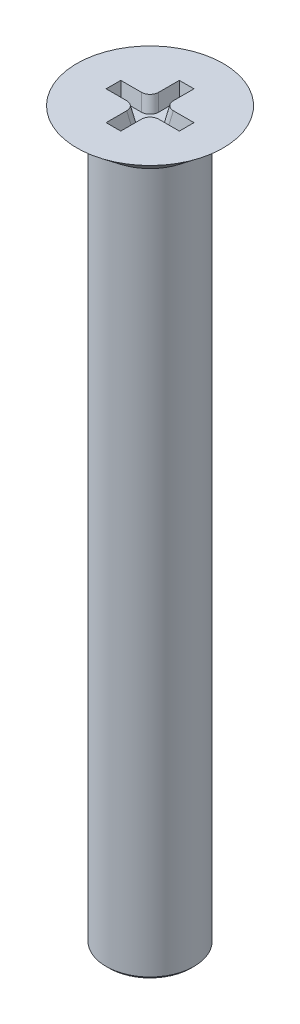
ISO-10303-21;
HEADER;
FILE_DESCRIPTION(('STEP AP214'),'2;1');
FILE_NAME('part.step','',(''),(''),'','','');
FILE_SCHEMA(('AUTOMOTIVE_DESIGN { 1 0 10303 214 1 1 1 1 }'));
ENDSEC;
DATA;
#1=APPLICATION_CONTEXT('core data for automotive mechanical design processes');
#2=APPLICATION_PROTOCOL_DEFINITION('international standard','automotive_design',2000,#1);
#3=PRODUCT_CONTEXT('',#1,'mechanical');
#4=PRODUCT('Part','Part','',(#3));
#5=PRODUCT_RELATED_PRODUCT_CATEGORY('part','',(#4));
#6=PRODUCT_DEFINITION_FORMATION('','',#4);
#7=PRODUCT_DEFINITION_CONTEXT('part definition',#1,'design');
#8=PRODUCT_DEFINITION('design','',#6,#7);
#9=PRODUCT_DEFINITION_SHAPE('','',#8);
#10=(LENGTH_UNIT() NAMED_UNIT(*) SI_UNIT(.MILLI.,.METRE.));
#11=(NAMED_UNIT(*) PLANE_ANGLE_UNIT() SI_UNIT($,.RADIAN.));
#12=(NAMED_UNIT(*) SI_UNIT($,.STERADIAN.) SOLID_ANGLE_UNIT());
#13=UNCERTAINTY_MEASURE_WITH_UNIT(LENGTH_MEASURE(1.E-05),#10,'distance_accuracy_value','');
#14=(GEOMETRIC_REPRESENTATION_CONTEXT(3) GLOBAL_UNCERTAINTY_ASSIGNED_CONTEXT((#13)) GLOBAL_UNIT_ASSIGNED_CONTEXT((#10,
#11,#12)) REPRESENTATION_CONTEXT('',''));
#15=CARTESIAN_POINT('',(0.,0.,0.));
#16=DIRECTION('',(0.,0.,1.));
#17=DIRECTION('',(1.,0.,0.));
#18=AXIS2_PLACEMENT_3D('',#15,#16,#17);
#19=CARTESIAN_POINT('',(0.,0.,0.));
#20=DIRECTION('',(0.,1.,0.));
#21=DIRECTION('',(0.,0.,1.));
#22=AXIS2_PLACEMENT_3D('',#19,#20,#21);
#23=PLANE('',#22);
#24=CARTESIAN_POINT('',(0.,0.,0.));
#25=DIRECTION('',(0.,-1.,0.));
#26=DIRECTION('',(0.,0.,-1.));
#27=AXIS2_PLACEMENT_3D('',#24,#25,#26);
#28=CIRCLE('',#27,2.5);
#29=CARTESIAN_POINT('',(0.,0.,-2.5));
#30=VERTEX_POINT('',#29);
#31=EDGE_CURVE('E256',#30,#30,#28,.T.);
#32=ORIENTED_EDGE('',*,*,#31,.F.);
#33=EDGE_LOOP('',(#32));
#34=FACE_BOUND('',#33,.T.);
#35=DIRECTION('',(1.,0.,0.));
#36=VECTOR('',#35,1.);
#37=CARTESIAN_POINT('',(0.,0.,-0.25));
#38=LINE('',#37,#36);
#39=CARTESIAN_POINT('',(-1.25,0.,-0.25));
#40=VERTEX_POINT('',#39);
#41=CARTESIAN_POINT('',(-0.545442325903662,0.,-0.25));
#42=VERTEX_POINT('',#41);
#43=EDGE_CURVE('E186',#40,#42,#38,.T.);
#44=ORIENTED_EDGE('',*,*,#43,.T.);
#45=CARTESIAN_POINT('',(-0.554627983565723,0.,-0.554627983565723));
#46=DIRECTION('',(0.,1.,0.));
#47=DIRECTION('',(-0.707106781186548,0.,-0.707106781186547));
#48=AXIS2_PLACEMENT_3D('',#45,#46,#47);
#49=ELLIPSE('',#48,0.309186702079241,0.3);
#50=CARTESIAN_POINT('',(-0.25,0.,-0.545442325903662));
#51=VERTEX_POINT('',#50);
#52=EDGE_CURVE('E274',#42,#51,#49,.T.);
#53=ORIENTED_EDGE('',*,*,#52,.T.);
#54=DIRECTION('',(0.,0.,1.));
#55=VECTOR('',#54,1.);
#56=CARTESIAN_POINT('',(-0.25,0.,0.));
#57=LINE('',#56,#55);
#58=CARTESIAN_POINT('',(-0.25,0.,-1.25));
#59=VERTEX_POINT('',#58);
#60=EDGE_CURVE('E184',#59,#51,#57,.T.);
#61=ORIENTED_EDGE('',*,*,#60,.F.);
#62=DIRECTION('',(1.,0.,0.));
#63=VECTOR('',#62,1.);
#64=CARTESIAN_POINT('',(0.,0.,-1.25));
#65=LINE('',#64,#63);
#66=CARTESIAN_POINT('',(0.25,0.,-1.25));
#67=VERTEX_POINT('',#66);
#68=EDGE_CURVE('E163',#59,#67,#65,.T.);
#69=ORIENTED_EDGE('',*,*,#68,.T.);
#70=DIRECTION('',(0.,0.,1.));
#71=VECTOR('',#70,1.);
#72=CARTESIAN_POINT('',(0.25,0.,0.));
#73=LINE('',#72,#71);
#74=CARTESIAN_POINT('',(0.25,0.,-0.545442325903662));
#75=VERTEX_POINT('',#74);
#76=EDGE_CURVE('E175',#67,#75,#73,.T.);
#77=ORIENTED_EDGE('',*,*,#76,.T.);
#78=CARTESIAN_POINT('',(0.554627983565724,0.,-0.554627983565723));
#79=DIRECTION('',(0.,1.,0.));
#80=DIRECTION('',(0.707106781186547,0.,-0.707106781186548));
#81=AXIS2_PLACEMENT_3D('',#78,#79,#80);
#82=ELLIPSE('',#81,0.309186702079241,0.3);
#83=CARTESIAN_POINT('',(0.545442325903663,0.,-0.25));
#84=VERTEX_POINT('',#83);
#85=EDGE_CURVE('E272',#75,#84,#82,.T.);
#86=ORIENTED_EDGE('',*,*,#85,.T.);
#87=DIRECTION('',(1.,0.,0.));
#88=VECTOR('',#87,1.);
#89=CARTESIAN_POINT('',(0.,0.,-0.25));
#90=LINE('',#89,#88);
#91=CARTESIAN_POINT('',(1.25,0.,-0.25));
#92=VERTEX_POINT('',#91);
#93=EDGE_CURVE('E180',#84,#92,#90,.T.);
#94=ORIENTED_EDGE('',*,*,#93,.T.);
#95=DIRECTION('',(0.,0.,-1.));
#96=VECTOR('',#95,1.);
#97=CARTESIAN_POINT('',(1.25,0.,0.));
#98=LINE('',#97,#96);
#99=CARTESIAN_POINT('',(1.25,0.,0.25));
#100=VERTEX_POINT('',#99);
#101=EDGE_CURVE('E206',#100,#92,#98,.T.);
#102=ORIENTED_EDGE('',*,*,#101,.F.);
#103=DIRECTION('',(1.,0.,0.));
#104=VECTOR('',#103,1.);
#105=CARTESIAN_POINT('',(0.,0.,0.25));
#106=LINE('',#105,#104);
#107=CARTESIAN_POINT('',(0.545442325903663,0.,0.25));
#108=VERTEX_POINT('',#107);
#109=EDGE_CURVE('E204',#108,#100,#106,.T.);
#110=ORIENTED_EDGE('',*,*,#109,.F.);
#111=CARTESIAN_POINT('',(0.554627983565724,0.,0.554627983565724));
#112=DIRECTION('',(0.,1.,0.));
#113=DIRECTION('',(0.707106781186548,0.,0.707106781186547));
#114=AXIS2_PLACEMENT_3D('',#111,#112,#113);
#115=ELLIPSE('',#114,0.309186702079241,0.3);
#116=CARTESIAN_POINT('',(0.25,0.,0.545442325903663));
#117=VERTEX_POINT('',#116);
#118=EDGE_CURVE('E268',#108,#117,#115,.T.);
#119=ORIENTED_EDGE('',*,*,#118,.T.);
#120=DIRECTION('',(0.,0.,1.));
#121=VECTOR('',#120,1.);
#122=CARTESIAN_POINT('',(0.25,0.,0.));
#123=LINE('',#122,#121);
#124=CARTESIAN_POINT('',(0.250000000000001,0.,1.25));
#125=VERTEX_POINT('',#124);
#126=EDGE_CURVE('E202',#117,#125,#123,.T.);
#127=ORIENTED_EDGE('',*,*,#126,.T.);
#128=DIRECTION('',(1.,0.,0.));
#129=VECTOR('',#128,1.);
#130=CARTESIAN_POINT('',(0.,0.,1.25));
#131=LINE('',#130,#129);
#132=CARTESIAN_POINT('',(-0.249999999999999,0.,1.25));
#133=VERTEX_POINT('',#132);
#134=EDGE_CURVE('E199',#133,#125,#131,.T.);
#135=ORIENTED_EDGE('',*,*,#134,.F.);
#136=DIRECTION('',(0.,0.,1.));
#137=VECTOR('',#136,1.);
#138=CARTESIAN_POINT('',(-0.25,0.,0.));
#139=LINE('',#138,#137);
#140=CARTESIAN_POINT('',(-0.25,0.,0.545442325903662));
#141=VERTEX_POINT('',#140);
#142=EDGE_CURVE('E197',#141,#133,#139,.T.);
#143=ORIENTED_EDGE('',*,*,#142,.F.);
#144=CARTESIAN_POINT('',(-0.554627983565723,0.,0.554627983565724));
#145=DIRECTION('',(0.,1.,0.));
#146=DIRECTION('',(-0.707106781186547,0.,0.707106781186548));
#147=AXIS2_PLACEMENT_3D('',#144,#145,#146);
#148=ELLIPSE('',#147,0.309186702079241,0.3);
#149=CARTESIAN_POINT('',(-0.545442325903662,0.,0.25));
#150=VERTEX_POINT('',#149);
#151=EDGE_CURVE('E270',#141,#150,#148,.T.);
#152=ORIENTED_EDGE('',*,*,#151,.T.);
#153=DIRECTION('',(1.,0.,0.));
#154=VECTOR('',#153,1.);
#155=CARTESIAN_POINT('',(0.,0.,0.25));
#156=LINE('',#155,#154);
#157=CARTESIAN_POINT('',(-1.25,0.,0.25));
#158=VERTEX_POINT('',#157);
#159=EDGE_CURVE('E194',#158,#150,#156,.T.);
#160=ORIENTED_EDGE('',*,*,#159,.F.);
#161=DIRECTION('',(0.,0.,-1.));
#162=VECTOR('',#161,1.);
#163=CARTESIAN_POINT('',(-1.25,0.,0.));
#164=LINE('',#163,#162);
#165=EDGE_CURVE('E191',#158,#40,#164,.T.);
#166=ORIENTED_EDGE('',*,*,#165,.T.);
#167=EDGE_LOOP('',(#44,#53,#61,#69,#77,#86,#94,#102,#110,#119,#127,#135,#143,#152,#160,#166));
#168=FACE_BOUND('',#167,.T.);
#169=ADVANCED_FACE('F47',(#34,#168),#23,.T.);
#170=CARTESIAN_POINT('',(0.,-0.8,0.));
#171=DIRECTION('',(0.,1.,0.));
#172=DIRECTION('',(0.,0.,1.));
#173=AXIS2_PLACEMENT_3D('',#170,#171,#172);
#174=CONICAL_SURFACE('',#173,1.5,0.896055384571344);
#175=ORIENTED_EDGE('',*,*,#31,.T.);
#176=EDGE_LOOP('',(#175));
#177=FACE_BOUND('',#176,.T.);
#178=CARTESIAN_POINT('',(0.,-0.8,0.));
#179=DIRECTION('',(0.,-1.,0.));
#180=DIRECTION('',(0.,0.,-1.));
#181=AXIS2_PLACEMENT_3D('',#178,#179,#180);
#182=CIRCLE('',#181,1.5);
#183=CARTESIAN_POINT('',(0.,-0.8,-1.5));
#184=VERTEX_POINT('',#183);
#185=EDGE_CURVE('E212',#184,#184,#182,.T.);
#186=ORIENTED_EDGE('',*,*,#185,.F.);
#187=EDGE_LOOP('',(#186));
#188=FACE_BOUND('',#187,.T.);
#189=ADVANCED_FACE('F351',(#177,#188),#174,.T.);
#190=CARTESIAN_POINT('',(0.,-24.8,0.));
#191=DIRECTION('',(0.,1.,0.));
#192=DIRECTION('',(0.,0.,1.));
#193=AXIS2_PLACEMENT_3D('',#190,#191,#192);
#194=CYLINDRICAL_SURFACE('',#193,1.5);
#195=CARTESIAN_POINT('',(0.,-24.7,0.));
#196=DIRECTION('',(0.,-1.,0.));
#197=DIRECTION('',(0.,0.,-1.));
#198=AXIS2_PLACEMENT_3D('',#195,#196,#197);
#199=CIRCLE('',#198,1.5);
#200=CARTESIAN_POINT('',(0.,-24.7,-1.5));
#201=VERTEX_POINT('',#200);
#202=EDGE_CURVE('E262',#201,#201,#199,.F.);
#203=ORIENTED_EDGE('',*,*,#202,.T.);
#204=EDGE_LOOP('',(#203));
#205=FACE_BOUND('',#204,.T.);
#206=ORIENTED_EDGE('',*,*,#185,.T.);
#207=EDGE_LOOP('',(#206));
#208=FACE_BOUND('',#207,.T.);
#209=ADVANCED_FACE('F359',(#205,#208),#194,.T.);
#210=CARTESIAN_POINT('',(0.,-24.8,0.));
#211=DIRECTION('',(0.,-1.,0.));
#212=DIRECTION('',(0.,0.,-1.));
#213=AXIS2_PLACEMENT_3D('',#210,#211,#212);
#214=PLANE('',#213);
#215=CARTESIAN_POINT('',(0.,-24.8,0.));
#216=DIRECTION('',(0.,-1.,0.));
#217=DIRECTION('',(0.,0.,-1.));
#218=AXIS2_PLACEMENT_3D('',#215,#216,#217);
#219=CIRCLE('',#218,1.4);
#220=CARTESIAN_POINT('',(0.,-24.8,-1.4));
#221=VERTEX_POINT('',#220);
#222=EDGE_CURVE('E259',#221,#221,#219,.T.);
#223=ORIENTED_EDGE('',*,*,#222,.T.);
#224=EDGE_LOOP('',(#223));
#225=FACE_BOUND('',#224,.T.);
#226=ADVANCED_FACE('F371',(#225),#214,.T.);
#227=CARTESIAN_POINT('',(0.,-24.8,0.));
#228=DIRECTION('',(0.,1.,0.));
#229=DIRECTION('',(0.,0.,1.));
#230=AXIS2_PLACEMENT_3D('',#227,#228,#229);
#231=CONICAL_SURFACE('',#230,1.4,0.785398163397461);
#232=ORIENTED_EDGE('',*,*,#202,.F.);
#233=EDGE_LOOP('',(#232));
#234=FACE_BOUND('',#233,.T.);
#235=ORIENTED_EDGE('',*,*,#222,.F.);
#236=EDGE_LOOP('',(#235));
#237=FACE_BOUND('',#236,.T.);
#238=ADVANCED_FACE('F366',(#234,#237),#231,.T.);
#239=CARTESIAN_POINT('',(0.,0.,-0.25));
#240=DIRECTION('',(0.,-0.17364817766693,-0.984807753012208));
#241=DIRECTION('',(0.,0.984807753012208,-0.17364817766693));
#242=AXIS2_PLACEMENT_3D('',#239,#240,#241);
#243=PLANE('',#242);
#244=ORIENTED_EDGE('',*,*,#93,.F.);
#245=DIRECTION('',(-0.171087869746036,-0.970287525247814,0.171087869746036));
#246=VECTOR('',#245,1.);
#247=CARTESIAN_POINT('',(0.529476651306003,-0.0905458400836372,-0.234034325402341));
#248=LINE('',#247,#246);
#249=CARTESIAN_POINT('',(0.45727883554943,-0.5,-0.161836509645767));
#250=VERTEX_POINT('',#249);
#251=EDGE_CURVE('E279',#84,#250,#248,.T.);
#252=ORIENTED_EDGE('',*,*,#251,.T.);
#253=DIRECTION('',(-1.,0.,0.));
#254=VECTOR('',#253,1.);
#255=CARTESIAN_POINT('',(0.,-0.5,-0.161836509645767));
#256=LINE('',#255,#254);
#257=CARTESIAN_POINT('',(1.16183650964577,-0.5,-0.161836509645767));
#258=VERTEX_POINT('',#257);
#259=EDGE_CURVE('E209',#250,#258,#256,.F.);
#260=ORIENTED_EDGE('',*,*,#259,.T.);
#261=DIRECTION('',(-0.171087869746036,-0.970287525247814,0.171087869746036));
#262=VECTOR('',#261,1.);
#263=CARTESIAN_POINT('',(1.2134111760322,-0.207505532169751,-0.213411176032204));
#264=LINE('',#263,#262);
#265=EDGE_CURVE('E210',#258,#92,#264,.F.);
#266=ORIENTED_EDGE('',*,*,#265,.T.);
#267=EDGE_LOOP('',(#244,#252,#260,#266));
#268=FACE_BOUND('',#267,.T.);
#269=ADVANCED_FACE('F335',(#268),#243,.F.);
#270=CARTESIAN_POINT('',(1.25,0.,0.));
#271=DIRECTION('',(0.984807753012208,-0.17364817766693,0.));
#272=DIRECTION('',(0.17364817766693,0.984807753012208,0.));
#273=AXIS2_PLACEMENT_3D('',#270,#271,#272);
#274=PLANE('',#273);
#275=ORIENTED_EDGE('',*,*,#101,.T.);
#276=ORIENTED_EDGE('',*,*,#265,.F.);
#277=DIRECTION('',(0.,0.,-1.));
#278=VECTOR('',#277,1.);
#279=CARTESIAN_POINT('',(1.16183650964577,-0.5,0.));
#280=LINE('',#279,#278);
#281=CARTESIAN_POINT('',(1.16183650964577,-0.5,0.161836509645768));
#282=VERTEX_POINT('',#281);
#283=EDGE_CURVE('E171',#282,#258,#280,.T.);
#284=ORIENTED_EDGE('',*,*,#283,.F.);
#285=DIRECTION('',(0.171087869746036,0.970287525247814,0.171087869746036));
#286=VECTOR('',#285,1.);
#287=CARTESIAN_POINT('',(1.2134111760322,-0.207505532169751,0.213411176032205));
#288=LINE('',#287,#286);
#289=EDGE_CURVE('E213',#282,#100,#288,.T.);
#290=ORIENTED_EDGE('',*,*,#289,.T.);
#291=EDGE_LOOP('',(#275,#276,#284,#290));
#292=FACE_BOUND('',#291,.T.);
#293=ADVANCED_FACE('F339',(#292),#274,.F.);
#294=CARTESIAN_POINT('',(0.,0.,0.25));
#295=DIRECTION('',(0.,-0.17364817766693,0.984807753012208));
#296=DIRECTION('',(0.,-0.984807753012208,-0.17364817766693));
#297=AXIS2_PLACEMENT_3D('',#294,#295,#296);
#298=PLANE('',#297);
#299=DIRECTION('',(1.,0.,0.));
#300=VECTOR('',#299,1.);
#301=CARTESIAN_POINT('',(0.,-0.5,0.161836509645768));
#302=LINE('',#301,#300);
#303=CARTESIAN_POINT('',(0.45727883554943,-0.5,0.161836509645768));
#304=VERTEX_POINT('',#303);
#305=EDGE_CURVE('E232',#304,#282,#302,.T.);
#306=ORIENTED_EDGE('',*,*,#305,.F.);
#307=DIRECTION('',(-0.171087869746036,-0.970287525247814,-0.171087869746036));
#308=VECTOR('',#307,1.);
#309=CARTESIAN_POINT('',(0.536794416099563,-0.049044733649687,0.2413520901959));
#310=LINE('',#309,#308);
#311=EDGE_CURVE('E286',#304,#108,#310,.F.);
#312=ORIENTED_EDGE('',*,*,#311,.T.);
#313=ORIENTED_EDGE('',*,*,#109,.T.);
#314=ORIENTED_EDGE('',*,*,#289,.F.);
#315=EDGE_LOOP('',(#306,#312,#313,#314));
#316=FACE_BOUND('',#315,.T.);
#317=ADVANCED_FACE('F343',(#316),#298,.F.);
#318=CARTESIAN_POINT('',(0.25,0.,0.));
#319=DIRECTION('',(0.984807753012208,-0.17364817766693,0.));
#320=DIRECTION('',(0.17364817766693,0.984807753012208,0.));
#321=AXIS2_PLACEMENT_3D('',#318,#319,#320);
#322=PLANE('',#321);
#323=ORIENTED_EDGE('',*,*,#126,.F.);
#324=DIRECTION('',(0.171087869746036,0.970287525247814,0.171087869746036));
#325=VECTOR('',#324,1.);
#326=CARTESIAN_POINT('',(0.153188599841668,-0.549044733649687,0.44863092574533));
#327=LINE('',#326,#325);
#328=CARTESIAN_POINT('',(0.161836509645768,-0.5,0.45727883554943));
#329=VERTEX_POINT('',#328);
#330=EDGE_CURVE('E62',#117,#329,#327,.F.);
#331=ORIENTED_EDGE('',*,*,#330,.T.);
#332=DIRECTION('',(0.,0.,-1.));
#333=VECTOR('',#332,1.);
#334=CARTESIAN_POINT('',(0.161836509645768,-0.5,0.));
#335=LINE('',#334,#333);
#336=CARTESIAN_POINT('',(0.161836509645768,-0.5,1.16183650964577));
#337=VERTEX_POINT('',#336);
#338=EDGE_CURVE('E234',#329,#337,#335,.F.);
#339=ORIENTED_EDGE('',*,*,#338,.T.);
#340=DIRECTION('',(-0.171087869746036,-0.970287525247814,-0.171087869746036));
#341=VECTOR('',#340,1.);
#342=CARTESIAN_POINT('',(0.213411176032205,-0.207505532169751,1.2134111760322));
#343=LINE('',#342,#341);
#344=EDGE_CURVE('E223',#337,#125,#343,.F.);
#345=ORIENTED_EDGE('',*,*,#344,.T.);
#346=EDGE_LOOP('',(#323,#331,#339,#345));
#347=FACE_BOUND('',#346,.T.);
#348=ADVANCED_FACE('F461',(#347),#322,.F.);
#349=CARTESIAN_POINT('',(0.,0.,1.25));
#350=DIRECTION('',(0.,-0.17364817766693,0.984807753012208));
#351=DIRECTION('',(0.,-0.984807753012208,-0.17364817766693));
#352=AXIS2_PLACEMENT_3D('',#349,#350,#351);
#353=PLANE('',#352);
#354=ORIENTED_EDGE('',*,*,#134,.T.);
#355=ORIENTED_EDGE('',*,*,#344,.F.);
#356=DIRECTION('',(1.,0.,0.));
#357=VECTOR('',#356,1.);
#358=CARTESIAN_POINT('',(0.,-0.5,1.16183650964577));
#359=LINE('',#358,#357);
#360=CARTESIAN_POINT('',(-0.161836509645767,-0.5,1.16183650964577));
#361=VERTEX_POINT('',#360);
#362=EDGE_CURVE('E236',#361,#337,#359,.T.);
#363=ORIENTED_EDGE('',*,*,#362,.F.);
#364=DIRECTION('',(-0.171087869746036,0.970287525247814,0.171087869746036));
#365=VECTOR('',#364,1.);
#366=CARTESIAN_POINT('',(-0.213411176032204,-0.207505532169751,1.2134111760322));
#367=LINE('',#366,#365);
#368=EDGE_CURVE('E220',#361,#133,#367,.T.);
#369=ORIENTED_EDGE('',*,*,#368,.T.);
#370=EDGE_LOOP('',(#354,#355,#363,#369));
#371=FACE_BOUND('',#370,.T.);
#372=ADVANCED_FACE('F453',(#371),#353,.F.);
#373=CARTESIAN_POINT('',(-0.25,0.,0.));
#374=DIRECTION('',(-0.984807753012208,-0.17364817766693,0.));
#375=DIRECTION('',(0.17364817766693,-0.984807753012208,0.));
#376=AXIS2_PLACEMENT_3D('',#373,#374,#375);
#377=PLANE('',#376);
#378=DIRECTION('',(0.,0.,1.));
#379=VECTOR('',#378,1.);
#380=CARTESIAN_POINT('',(-0.161836509645767,-0.5,0.));
#381=LINE('',#380,#379);
#382=CARTESIAN_POINT('',(-0.161836509645767,-0.5,0.45727883554943));
#383=VERTEX_POINT('',#382);
#384=EDGE_CURVE('E239',#383,#361,#381,.T.);
#385=ORIENTED_EDGE('',*,*,#384,.F.);
#386=DIRECTION('',(-0.171087869746036,0.970287525247814,0.171087869746036));
#387=VECTOR('',#386,1.);
#388=CARTESIAN_POINT('',(-0.23403432540234,-0.0905458400836372,0.529476651306003));
#389=LINE('',#388,#387);
#390=EDGE_CURVE('E281',#383,#141,#389,.T.);
#391=ORIENTED_EDGE('',*,*,#390,.T.);
#392=ORIENTED_EDGE('',*,*,#142,.T.);
#393=ORIENTED_EDGE('',*,*,#368,.F.);
#394=EDGE_LOOP('',(#385,#391,#392,#393));
#395=FACE_BOUND('',#394,.T.);
#396=ADVANCED_FACE('F304',(#395),#377,.F.);
#397=CARTESIAN_POINT('',(0.,0.,0.25));
#398=DIRECTION('',(0.,-0.17364817766693,0.984807753012208));
#399=DIRECTION('',(0.,-0.984807753012208,-0.17364817766693));
#400=AXIS2_PLACEMENT_3D('',#397,#398,#399);
#401=PLANE('',#400);
#402=ORIENTED_EDGE('',*,*,#159,.T.);
#403=DIRECTION('',(-0.171087869746036,0.970287525247814,0.171087869746036));
#404=VECTOR('',#403,1.);
#405=CARTESIAN_POINT('',(-0.529476651306003,-0.0905458400836371,0.234034325402341));
#406=LINE('',#405,#404);
#407=CARTESIAN_POINT('',(-0.457278835549429,-0.5,0.161836509645768));
#408=VERTEX_POINT('',#407);
#409=EDGE_CURVE('E284',#150,#408,#406,.F.);
#410=ORIENTED_EDGE('',*,*,#409,.T.);
#411=DIRECTION('',(1.,0.,0.));
#412=VECTOR('',#411,1.);
#413=CARTESIAN_POINT('',(0.,-0.5,0.161836509645768));
#414=LINE('',#413,#412);
#415=CARTESIAN_POINT('',(-1.16183650964577,-0.5,0.161836509645768));
#416=VERTEX_POINT('',#415);
#417=EDGE_CURVE('E241',#416,#408,#414,.T.);
#418=ORIENTED_EDGE('',*,*,#417,.F.);
#419=DIRECTION('',(0.171087869746036,-0.970287525247814,-0.171087869746036));
#420=VECTOR('',#419,1.);
#421=CARTESIAN_POINT('',(-1.2134111760322,-0.207505532169751,0.213411176032205));
#422=LINE('',#421,#420);
#423=EDGE_CURVE('E218',#416,#158,#422,.F.);
#424=ORIENTED_EDGE('',*,*,#423,.T.);
#425=EDGE_LOOP('',(#402,#410,#418,#424));
#426=FACE_BOUND('',#425,.T.);
#427=ADVANCED_FACE('F311',(#426),#401,.F.);
#428=CARTESIAN_POINT('',(-1.25,0.,0.));
#429=DIRECTION('',(-0.984807753012208,-0.17364817766693,0.));
#430=DIRECTION('',(0.17364817766693,-0.984807753012208,0.));
#431=AXIS2_PLACEMENT_3D('',#428,#429,#430);
#432=PLANE('',#431);
#433=ORIENTED_EDGE('',*,*,#165,.F.);
#434=ORIENTED_EDGE('',*,*,#423,.F.);
#435=DIRECTION('',(0.,0.,1.));
#436=VECTOR('',#435,1.);
#437=CARTESIAN_POINT('',(-1.16183650964577,-0.5,0.));
#438=LINE('',#437,#436);
#439=CARTESIAN_POINT('',(-1.16183650964577,-0.5,-0.161836509645767));
#440=VERTEX_POINT('',#439);
#441=EDGE_CURVE('E244',#416,#440,#438,.F.);
#442=ORIENTED_EDGE('',*,*,#441,.T.);
#443=DIRECTION('',(-0.171087869746036,0.970287525247814,-0.171087869746036));
#444=VECTOR('',#443,1.);
#445=CARTESIAN_POINT('',(-1.2134111760322,-0.207505532169751,-0.213411176032204));
#446=LINE('',#445,#444);
#447=EDGE_CURVE('E216',#440,#40,#446,.T.);
#448=ORIENTED_EDGE('',*,*,#447,.T.);
#449=EDGE_LOOP('',(#433,#434,#442,#448));
#450=FACE_BOUND('',#449,.T.);
#451=ADVANCED_FACE('F314',(#450),#432,.F.);
#452=CARTESIAN_POINT('',(0.,0.,-0.25));
#453=DIRECTION('',(0.,-0.17364817766693,-0.984807753012208));
#454=DIRECTION('',(0.,0.984807753012208,-0.17364817766693));
#455=AXIS2_PLACEMENT_3D('',#452,#453,#454);
#456=PLANE('',#455);
#457=DIRECTION('',(-1.,0.,0.));
#458=VECTOR('',#457,1.);
#459=CARTESIAN_POINT('',(0.,-0.5,-0.161836509645767));
#460=LINE('',#459,#458);
#461=CARTESIAN_POINT('',(-0.457278835549429,-0.5,-0.161836509645767));
#462=VERTEX_POINT('',#461);
#463=EDGE_CURVE('E246',#440,#462,#460,.F.);
#464=ORIENTED_EDGE('',*,*,#463,.T.);
#465=DIRECTION('',(-0.171087869746036,0.970287525247814,-0.171087869746036));
#466=VECTOR('',#465,1.);
#467=CARTESIAN_POINT('',(-0.536794416099562,-0.0490447336496869,-0.2413520901959));
#468=LINE('',#467,#466);
#469=EDGE_CURVE('E265',#462,#42,#468,.T.);
#470=ORIENTED_EDGE('',*,*,#469,.T.);
#471=ORIENTED_EDGE('',*,*,#43,.F.);
#472=ORIENTED_EDGE('',*,*,#447,.F.);
#473=EDGE_LOOP('',(#464,#470,#471,#472));
#474=FACE_BOUND('',#473,.T.);
#475=ADVANCED_FACE('F318',(#474),#456,.F.);
#476=CARTESIAN_POINT('',(-0.25,0.,0.));
#477=DIRECTION('',(-0.984807753012208,-0.17364817766693,0.));
#478=DIRECTION('',(0.17364817766693,-0.984807753012208,0.));
#479=AXIS2_PLACEMENT_3D('',#476,#477,#478);
#480=PLANE('',#479);
#481=ORIENTED_EDGE('',*,*,#60,.T.);
#482=DIRECTION('',(0.171087869746036,-0.970287525247814,0.171087869746036));
#483=VECTOR('',#482,1.);
#484=CARTESIAN_POINT('',(-0.153188599841667,-0.549044733649687,-0.44863092574533));
#485=LINE('',#484,#483);
#486=CARTESIAN_POINT('',(-0.161836509645767,-0.5,-0.45727883554943));
#487=VERTEX_POINT('',#486);
#488=EDGE_CURVE('E276',#51,#487,#485,.T.);
#489=ORIENTED_EDGE('',*,*,#488,.T.);
#490=DIRECTION('',(0.,0.,1.));
#491=VECTOR('',#490,1.);
#492=CARTESIAN_POINT('',(-0.161836509645767,-0.5,0.));
#493=LINE('',#492,#491);
#494=CARTESIAN_POINT('',(-0.161836509645767,-0.5,-1.16183650964577));
#495=VERTEX_POINT('',#494);
#496=EDGE_CURVE('E249',#495,#487,#493,.T.);
#497=ORIENTED_EDGE('',*,*,#496,.F.);
#498=DIRECTION('',(0.171087869746036,-0.970287525247814,0.171087869746036));
#499=VECTOR('',#498,1.);
#500=CARTESIAN_POINT('',(-0.213411176032204,-0.207505532169751,-1.2134111760322));
#501=LINE('',#500,#499);
#502=EDGE_CURVE('E170',#495,#59,#501,.F.);
#503=ORIENTED_EDGE('',*,*,#502,.T.);
#504=EDGE_LOOP('',(#481,#489,#497,#503));
#505=FACE_BOUND('',#504,.T.);
#506=ADVANCED_FACE('F327',(#505),#480,.F.);
#507=CARTESIAN_POINT('',(0.,0.,-1.25));
#508=DIRECTION('',(0.,-0.17364817766693,-0.984807753012208));
#509=DIRECTION('',(0.,0.984807753012208,-0.17364817766693));
#510=AXIS2_PLACEMENT_3D('',#507,#508,#509);
#511=PLANE('',#510);
#512=ORIENTED_EDGE('',*,*,#68,.F.);
#513=ORIENTED_EDGE('',*,*,#502,.F.);
#514=DIRECTION('',(-1.,0.,0.));
#515=VECTOR('',#514,1.);
#516=CARTESIAN_POINT('',(0.,-0.5,-1.16183650964577));
#517=LINE('',#516,#515);
#518=CARTESIAN_POINT('',(0.161836509645768,-0.5,-1.16183650964577));
#519=VERTEX_POINT('',#518);
#520=EDGE_CURVE('E166',#495,#519,#517,.F.);
#521=ORIENTED_EDGE('',*,*,#520,.T.);
#522=DIRECTION('',(0.171087869746036,0.970287525247814,-0.171087869746036));
#523=VECTOR('',#522,1.);
#524=CARTESIAN_POINT('',(0.213411176032205,-0.207505532169751,-1.2134111760322));
#525=LINE('',#524,#523);
#526=EDGE_CURVE('E159',#519,#67,#525,.T.);
#527=ORIENTED_EDGE('',*,*,#526,.T.);
#528=EDGE_LOOP('',(#512,#513,#521,#527));
#529=FACE_BOUND('',#528,.T.);
#530=ADVANCED_FACE('F161',(#529),#511,.F.);
#531=CARTESIAN_POINT('',(0.25,0.,0.));
#532=DIRECTION('',(0.984807753012208,-0.17364817766693,0.));
#533=DIRECTION('',(0.17364817766693,0.984807753012208,0.));
#534=AXIS2_PLACEMENT_3D('',#531,#532,#533);
#535=PLANE('',#534);
#536=DIRECTION('',(0.,0.,-1.));
#537=VECTOR('',#536,1.);
#538=CARTESIAN_POINT('',(0.161836509645768,-0.5,0.));
#539=LINE('',#538,#537);
#540=CARTESIAN_POINT('',(0.161836509645768,-0.5,-0.45727883554943));
#541=VERTEX_POINT('',#540);
#542=EDGE_CURVE('E229',#519,#541,#539,.F.);
#543=ORIENTED_EDGE('',*,*,#542,.T.);
#544=DIRECTION('',(-0.171087869746036,-0.970287525247814,0.171087869746036));
#545=VECTOR('',#544,1.);
#546=CARTESIAN_POINT('',(0.234034325402341,-0.0905458400836371,-0.529476651306003));
#547=LINE('',#546,#545);
#548=EDGE_CURVE('E178',#541,#75,#547,.F.);
#549=ORIENTED_EDGE('',*,*,#548,.T.);
#550=ORIENTED_EDGE('',*,*,#76,.F.);
#551=ORIENTED_EDGE('',*,*,#526,.F.);
#552=EDGE_LOOP('',(#543,#549,#550,#551));
#553=FACE_BOUND('',#552,.T.);
#554=ADVANCED_FACE('F176',(#553),#535,.F.);
#555=CARTESIAN_POINT('',(0.,-0.5,0.));
#556=DIRECTION('',(0.,1.,0.));
#557=DIRECTION('',(0.,0.,1.));
#558=AXIS2_PLACEMENT_3D('',#555,#556,#557);
#559=PLANE('',#558);
#560=ORIENTED_EDGE('',*,*,#259,.F.);
#561=CARTESIAN_POINT('',(0.466464493211491,-0.5,-0.466464493211491));
#562=DIRECTION('',(0.,1.,0.));
#563=DIRECTION('',(0.707106781186547,0.,-0.707106781186548));
#564=AXIS2_PLACEMENT_3D('',#561,#562,#563);
#565=ELLIPSE('',#564,0.309186702079241,0.3);
#566=EDGE_CURVE('E292',#250,#541,#565,.F.);
#567=ORIENTED_EDGE('',*,*,#566,.T.);
#568=ORIENTED_EDGE('',*,*,#542,.F.);
#569=ORIENTED_EDGE('',*,*,#520,.F.);
#570=ORIENTED_EDGE('',*,*,#496,.T.);
#571=CARTESIAN_POINT('',(-0.466464493211491,-0.5,-0.466464493211491));
#572=DIRECTION('',(0.,1.,0.));
#573=DIRECTION('',(-0.707106781186548,0.,-0.707106781186547));
#574=AXIS2_PLACEMENT_3D('',#571,#572,#573);
#575=ELLIPSE('',#574,0.309186702079241,0.3);
#576=EDGE_CURVE('E290',#487,#462,#575,.F.);
#577=ORIENTED_EDGE('',*,*,#576,.T.);
#578=ORIENTED_EDGE('',*,*,#463,.F.);
#579=ORIENTED_EDGE('',*,*,#441,.F.);
#580=ORIENTED_EDGE('',*,*,#417,.T.);
#581=CARTESIAN_POINT('',(-0.46646449321149,-0.5,0.466464493211491));
#582=DIRECTION('',(0.,1.,0.));
#583=DIRECTION('',(-0.707106781186547,0.,0.707106781186548));
#584=AXIS2_PLACEMENT_3D('',#581,#582,#583);
#585=ELLIPSE('',#584,0.309186702079241,0.3);
#586=EDGE_CURVE('E55',#408,#383,#585,.F.);
#587=ORIENTED_EDGE('',*,*,#586,.T.);
#588=ORIENTED_EDGE('',*,*,#384,.T.);
#589=ORIENTED_EDGE('',*,*,#362,.T.);
#590=ORIENTED_EDGE('',*,*,#338,.F.);
#591=CARTESIAN_POINT('',(0.466464493211491,-0.5,0.466464493211491));
#592=DIRECTION('',(0.,1.,0.));
#593=DIRECTION('',(0.707106781186548,0.,0.707106781186547));
#594=AXIS2_PLACEMENT_3D('',#591,#592,#593);
#595=ELLIPSE('',#594,0.309186702079241,0.3);
#596=EDGE_CURVE('E11',#329,#304,#595,.F.);
#597=ORIENTED_EDGE('',*,*,#596,.T.);
#598=ORIENTED_EDGE('',*,*,#305,.T.);
#599=ORIENTED_EDGE('',*,*,#283,.T.);
#600=EDGE_LOOP('',(#560,#567,#568,#569,#570,#577,#578,#579,#580,#587,#588,#589,#590,#597,#598,#599));
#601=FACE_BOUND('',#600,.T.);
#602=ADVANCED_FACE('F296',(#601),#559,.T.);
#603=CARTESIAN_POINT('',(-0.529476651306003,-0.142640293383716,-0.529476651306003));
#604=DIRECTION('',(-0.171087869746036,0.970287525247814,-0.171087869746036));
#605=DIRECTION('',(-0.984807753012208,-0.17364817766693,0.));
#606=AXIS2_PLACEMENT_3D('',#603,#604,#605);
#607=CYLINDRICAL_SURFACE('',#606,0.3);
#608=ORIENTED_EDGE('',*,*,#576,.F.);
#609=ORIENTED_EDGE('',*,*,#488,.F.);
#610=ORIENTED_EDGE('',*,*,#52,.F.);
#611=ORIENTED_EDGE('',*,*,#469,.F.);
#612=EDGE_LOOP('',(#608,#609,#610,#611));
#613=FACE_BOUND('',#612,.T.);
#614=ADVANCED_FACE('F323',(#613),#607,.T.);
#615=CARTESIAN_POINT('',(0.529476651306003,-0.142640293383716,-0.529476651306003));
#616=DIRECTION('',(0.171087869746036,0.970287525247814,-0.171087869746036));
#617=DIRECTION('',(0.,0.17364817766693,0.984807753012208));
#618=AXIS2_PLACEMENT_3D('',#615,#616,#617);
#619=CYLINDRICAL_SURFACE('',#618,0.3);
#620=ORIENTED_EDGE('',*,*,#566,.F.);
#621=ORIENTED_EDGE('',*,*,#251,.F.);
#622=ORIENTED_EDGE('',*,*,#85,.F.);
#623=ORIENTED_EDGE('',*,*,#548,.F.);
#624=EDGE_LOOP('',(#620,#621,#622,#623));
#625=FACE_BOUND('',#624,.T.);
#626=ADVANCED_FACE('F330',(#625),#619,.T.);
#627=CARTESIAN_POINT('',(-0.529476651306003,-0.142640293383716,0.529476651306003));
#628=DIRECTION('',(-0.171087869746036,0.970287525247814,0.171087869746036));
#629=DIRECTION('',(0.,-0.17364817766693,0.984807753012208));
#630=AXIS2_PLACEMENT_3D('',#627,#628,#629);
#631=CYLINDRICAL_SURFACE('',#630,0.3);
#632=ORIENTED_EDGE('',*,*,#586,.F.);
#633=ORIENTED_EDGE('',*,*,#409,.F.);
#634=ORIENTED_EDGE('',*,*,#151,.F.);
#635=ORIENTED_EDGE('',*,*,#390,.F.);
#636=EDGE_LOOP('',(#632,#633,#634,#635));
#637=FACE_BOUND('',#636,.T.);
#638=ADVANCED_FACE('F307',(#637),#631,.T.);
#639=CARTESIAN_POINT('',(0.529476651306004,-0.142640293383716,0.529476651306003));
#640=DIRECTION('',(0.171087869746036,0.970287525247814,0.171087869746036));
#641=DIRECTION('',(-0.984807753012208,0.17364817766693,0.));
#642=AXIS2_PLACEMENT_3D('',#639,#640,#641);
#643=CYLINDRICAL_SURFACE('',#642,0.3);
#644=ORIENTED_EDGE('',*,*,#596,.F.);
#645=ORIENTED_EDGE('',*,*,#330,.F.);
#646=ORIENTED_EDGE('',*,*,#118,.F.);
#647=ORIENTED_EDGE('',*,*,#311,.F.);
#648=EDGE_LOOP('',(#644,#645,#646,#647));
#649=FACE_BOUND('',#648,.T.);
#650=ADVANCED_FACE('F49',(#649),#643,.T.);
#651=CLOSED_SHELL('',(#169,#189,#209,#226,#238,#269,#293,#317,#348,#372,#396,#427,#451,#475,
#506,#530,#554,#602,#614,#626,#638,#650));
#652=MANIFOLD_SOLID_BREP('B2',#651);
#653=ADVANCED_BREP_SHAPE_REPRESENTATION('',(#18,#652),#14);
#654=SHAPE_DEFINITION_REPRESENTATION(#9,#653);
ENDSEC;
END-ISO-10303-21;
